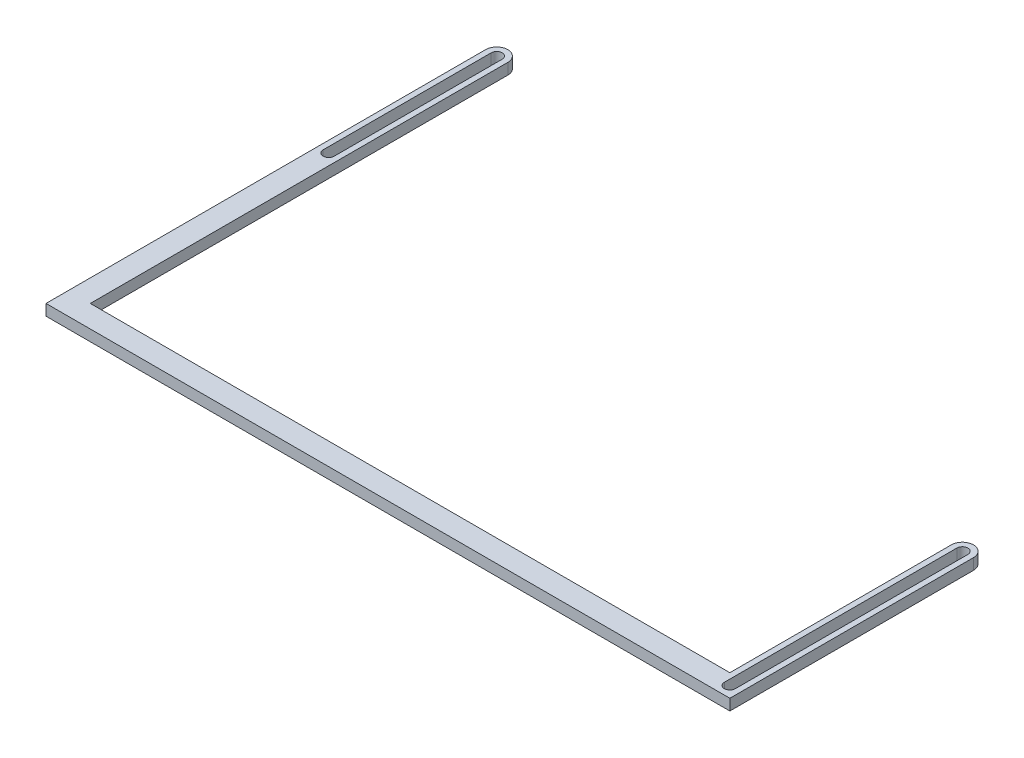
ISO-10303-21;
HEADER;
FILE_DESCRIPTION(('STEP AP214'),'2;1');
FILE_NAME('part.step','',(''),(''),'','','');
FILE_SCHEMA(('AUTOMOTIVE_DESIGN { 1 0 10303 214 1 1 1 1 }'));
ENDSEC;
DATA;
#1=APPLICATION_CONTEXT('core data for automotive mechanical design processes');
#2=APPLICATION_PROTOCOL_DEFINITION('international standard','automotive_design',2000,#1);
#3=PRODUCT_CONTEXT('',#1,'mechanical');
#4=PRODUCT('Part','Part','',(#3));
#5=PRODUCT_RELATED_PRODUCT_CATEGORY('part','',(#4));
#6=PRODUCT_DEFINITION_FORMATION('','',#4);
#7=PRODUCT_DEFINITION_CONTEXT('part definition',#1,'design');
#8=PRODUCT_DEFINITION('design','',#6,#7);
#9=PRODUCT_DEFINITION_SHAPE('','',#8);
#10=(LENGTH_UNIT() NAMED_UNIT(*) SI_UNIT(.MILLI.,.METRE.));
#11=(NAMED_UNIT(*) PLANE_ANGLE_UNIT() SI_UNIT($,.RADIAN.));
#12=(NAMED_UNIT(*) SI_UNIT($,.STERADIAN.) SOLID_ANGLE_UNIT());
#13=UNCERTAINTY_MEASURE_WITH_UNIT(LENGTH_MEASURE(1.E-05),#10,'distance_accuracy_value','');
#14=(GEOMETRIC_REPRESENTATION_CONTEXT(3) GLOBAL_UNCERTAINTY_ASSIGNED_CONTEXT((#13)) GLOBAL_UNIT_ASSIGNED_CONTEXT((#10,
#11,#12)) REPRESENTATION_CONTEXT('',''));
#15=CARTESIAN_POINT('',(0.,0.,0.));
#16=DIRECTION('',(0.,0.,1.));
#17=DIRECTION('',(1.,0.,0.));
#18=AXIS2_PLACEMENT_3D('',#15,#16,#17);
#19=CARTESIAN_POINT('',(68.1169302318838,-8.,-77.9999999999999));
#20=DIRECTION('',(0.,1.,0.));
#21=DIRECTION('',(0.,0.,1.));
#22=AXIS2_PLACEMENT_3D('',#19,#20,#21);
#23=PLANE('',#22);
#24=CARTESIAN_POINT('',(-170.948017198614,-8.,-148.837066578513));
#25=DIRECTION('',(0.,-1.,0.));
#26=DIRECTION('',(0.,0.,1.));
#27=AXIS2_PLACEMENT_3D('',#24,#25,#26);
#28=CIRCLE('',#27,2.);
#29=CARTESIAN_POINT('',(-172.948017198614,-8.,-148.837066578513));
#30=VERTEX_POINT('',#29);
#31=CARTESIAN_POINT('',(-168.948017198614,-8.,-148.837066578513));
#32=VERTEX_POINT('',#31);
#33=EDGE_CURVE('E184',#30,#32,#28,.T.);
#34=ORIENTED_EDGE('',*,*,#33,.F.);
#35=DIRECTION('',(0.,0.,-1.));
#36=VECTOR('',#35,1.);
#37=CARTESIAN_POINT('',(-172.948017198614,-8.,-148.837066578513));
#38=LINE('',#37,#36);
#39=CARTESIAN_POINT('',(-172.948017198614,-8.,-88.1363519774298));
#40=VERTEX_POINT('',#39);
#41=EDGE_CURVE('E192',#40,#30,#38,.T.);
#42=ORIENTED_EDGE('',*,*,#41,.F.);
#43=CARTESIAN_POINT('',(-170.948017198614,-8.,-88.1363519774298));
#44=DIRECTION('',(0.,-1.,0.));
#45=DIRECTION('',(0.,0.,-1.));
#46=AXIS2_PLACEMENT_3D('',#43,#44,#45);
#47=CIRCLE('',#46,2.);
#48=CARTESIAN_POINT('',(-168.948017198614,-8.,-88.1363519774298));
#49=VERTEX_POINT('',#48);
#50=EDGE_CURVE('E189',#49,#40,#47,.T.);
#51=ORIENTED_EDGE('',*,*,#50,.F.);
#52=DIRECTION('',(0.,0.,1.));
#53=VECTOR('',#52,1.);
#54=CARTESIAN_POINT('',(-168.948017198614,-8.,-148.837066578513));
#55=LINE('',#54,#53);
#56=EDGE_CURVE('E186',#32,#49,#55,.T.);
#57=ORIENTED_EDGE('',*,*,#56,.F.);
#58=EDGE_LOOP('',(#34,#42,#51,#57));
#59=FACE_BOUND('',#58,.T.);
#60=CARTESIAN_POINT('',(68.1169302318838,-8.,-77.9999999999999));
#61=DIRECTION('',(0.,-1.,0.));
#62=DIRECTION('',(0.,0.,1.));
#63=AXIS2_PLACEMENT_3D('',#60,#61,#62);
#64=CIRCLE('',#63,4.);
#65=CARTESIAN_POINT('',(64.1169302318838,-8.,-77.9999999999999));
#66=VERTEX_POINT('',#65);
#67=CARTESIAN_POINT('',(72.1169302318838,-8.,-77.9999999999999));
#68=VERTEX_POINT('',#67);
#69=EDGE_CURVE('E215',#66,#68,#64,.T.);
#70=ORIENTED_EDGE('',*,*,#69,.T.);
#71=DIRECTION('',(0.,0.,1.));
#72=VECTOR('',#71,1.);
#73=CARTESIAN_POINT('',(72.1169302318838,-8.,-77.9999999999999));
#74=LINE('',#73,#72);
#75=CARTESIAN_POINT('',(72.1169302318838,-8.,10.));
#76=VERTEX_POINT('',#75);
#77=EDGE_CURVE('E218',#68,#76,#74,.T.);
#78=ORIENTED_EDGE('',*,*,#77,.T.);
#79=DIRECTION('',(-1.,0.,0.));
#80=VECTOR('',#79,1.);
#81=CARTESIAN_POINT('',(72.1169302318838,-8.,10.));
#82=LINE('',#81,#80);
#83=CARTESIAN_POINT('',(-174.948017198614,-8.,9.99999999999997));
#84=VERTEX_POINT('',#83);
#85=EDGE_CURVE('E221',#76,#84,#82,.T.);
#86=ORIENTED_EDGE('',*,*,#85,.T.);
#87=DIRECTION('',(0.,0.,-1.));
#88=VECTOR('',#87,1.);
#89=CARTESIAN_POINT('',(-174.948017198614,-8.,9.99999999999997));
#90=LINE('',#89,#88);
#91=CARTESIAN_POINT('',(-174.948017198614,-8.,-148.837066578513));
#92=VERTEX_POINT('',#91);
#93=EDGE_CURVE('E223',#84,#92,#90,.T.);
#94=ORIENTED_EDGE('',*,*,#93,.T.);
#95=CARTESIAN_POINT('',(-170.948017198614,-8.,-148.837066578513));
#96=DIRECTION('',(0.,-1.,0.));
#97=DIRECTION('',(0.,0.,-1.));
#98=AXIS2_PLACEMENT_3D('',#95,#96,#97);
#99=CIRCLE('',#98,4.);
#100=CARTESIAN_POINT('',(-166.948017198614,-8.,-148.837066578513));
#101=VERTEX_POINT('',#100);
#102=EDGE_CURVE('E225',#92,#101,#99,.T.);
#103=ORIENTED_EDGE('',*,*,#102,.T.);
#104=DIRECTION('',(0.,0.,1.));
#105=VECTOR('',#104,1.);
#106=CARTESIAN_POINT('',(-166.948017198614,-8.,-148.837066578513));
#107=LINE('',#106,#105);
#108=CARTESIAN_POINT('',(-166.948017198614,-8.,1.99999999999997));
#109=VERTEX_POINT('',#108);
#110=EDGE_CURVE('E227',#101,#109,#107,.T.);
#111=ORIENTED_EDGE('',*,*,#110,.T.);
#112=DIRECTION('',(1.,0.,0.));
#113=VECTOR('',#112,1.);
#114=CARTESIAN_POINT('',(-9.06494743049759,-8.,1.99999999999999));
#115=LINE('',#114,#113);
#116=CARTESIAN_POINT('',(64.1169302318838,-8.,2.));
#117=VERTEX_POINT('',#116);
#118=EDGE_CURVE('E229',#109,#117,#115,.T.);
#119=ORIENTED_EDGE('',*,*,#118,.T.);
#120=DIRECTION('',(0.,0.,-1.));
#121=VECTOR('',#120,1.);
#122=CARTESIAN_POINT('',(64.1169302318838,-8.,-77.9999999999999));
#123=LINE('',#122,#121);
#124=EDGE_CURVE('E231',#117,#66,#123,.T.);
#125=ORIENTED_EDGE('',*,*,#124,.T.);
#126=EDGE_LOOP('',(#70,#78,#86,#94,#103,#111,#119,#125));
#127=FACE_BOUND('',#126,.T.);
#128=CARTESIAN_POINT('',(68.1169302318838,-8.,-77.9999999999999));
#129=DIRECTION('',(0.,-1.,0.));
#130=DIRECTION('',(0.,0.,1.));
#131=AXIS2_PLACEMENT_3D('',#128,#129,#130);
#132=CIRCLE('',#131,2.);
#133=CARTESIAN_POINT('',(66.1169302318838,-8.,-77.9999999999999));
#134=VERTEX_POINT('',#133);
#135=CARTESIAN_POINT('',(70.1169302318838,-8.,-77.9999999999999));
#136=VERTEX_POINT('',#135);
#137=EDGE_CURVE('E148',#134,#136,#132,.T.);
#138=ORIENTED_EDGE('',*,*,#137,.F.);
#139=DIRECTION('',(0.,0.,-1.));
#140=VECTOR('',#139,1.);
#141=CARTESIAN_POINT('',(66.1169302318838,-8.,-77.9999999999999));
#142=LINE('',#141,#140);
#143=CARTESIAN_POINT('',(66.1169302318838,-8.,5.99999999999998));
#144=VERTEX_POINT('',#143);
#145=EDGE_CURVE('E170',#144,#134,#142,.T.);
#146=ORIENTED_EDGE('',*,*,#145,.F.);
#147=CARTESIAN_POINT('',(68.1169302318838,-8.,5.99999999999998));
#148=DIRECTION('',(0.,-1.,0.));
#149=DIRECTION('',(0.,0.,-1.));
#150=AXIS2_PLACEMENT_3D('',#147,#148,#149);
#151=CIRCLE('',#150,2.);
#152=CARTESIAN_POINT('',(70.1169302318838,-8.,5.99999999999998));
#153=VERTEX_POINT('',#152);
#154=EDGE_CURVE('E168',#153,#144,#151,.T.);
#155=ORIENTED_EDGE('',*,*,#154,.F.);
#156=DIRECTION('',(0.,0.,1.));
#157=VECTOR('',#156,1.);
#158=CARTESIAN_POINT('',(70.1169302318838,-8.,-77.9999999999999));
#159=LINE('',#158,#157);
#160=EDGE_CURVE('E156',#136,#153,#159,.T.);
#161=ORIENTED_EDGE('',*,*,#160,.F.);
#162=EDGE_LOOP('',(#138,#146,#155,#161));
#163=FACE_BOUND('',#162,.T.);
#164=ADVANCED_FACE('F35',(#59,#127,#163),#23,.F.);
#165=CARTESIAN_POINT('',(68.1169302318838,-4.,-77.9999999999999));
#166=DIRECTION('',(0.,1.,0.));
#167=DIRECTION('',(0.,0.,1.));
#168=AXIS2_PLACEMENT_3D('',#165,#166,#167);
#169=PLANE('',#168);
#170=CARTESIAN_POINT('',(68.1169302318838,-4.,-77.9999999999999));
#171=DIRECTION('',(0.,-1.,0.));
#172=DIRECTION('',(0.,0.,1.));
#173=AXIS2_PLACEMENT_3D('',#170,#171,#172);
#174=CIRCLE('',#173,4.);
#175=CARTESIAN_POINT('',(64.1169302318838,-4.,-77.9999999999999));
#176=VERTEX_POINT('',#175);
#177=CARTESIAN_POINT('',(72.1169302318838,-4.,-77.9999999999999));
#178=VERTEX_POINT('',#177);
#179=EDGE_CURVE('E214',#176,#178,#174,.T.);
#180=ORIENTED_EDGE('',*,*,#179,.F.);
#181=DIRECTION('',(0.,0.,-1.));
#182=VECTOR('',#181,1.);
#183=CARTESIAN_POINT('',(64.1169302318838,-4.,-77.9999999999999));
#184=LINE('',#183,#182);
#185=CARTESIAN_POINT('',(64.1169302318838,-4.,2.));
#186=VERTEX_POINT('',#185);
#187=EDGE_CURVE('E219',#186,#176,#184,.T.);
#188=ORIENTED_EDGE('',*,*,#187,.F.);
#189=DIRECTION('',(1.,0.,0.));
#190=VECTOR('',#189,1.);
#191=CARTESIAN_POINT('',(64.1169302318838,-4.,2.));
#192=LINE('',#191,#190);
#193=CARTESIAN_POINT('',(-166.948017198614,-4.,1.99999999999997));
#194=VERTEX_POINT('',#193);
#195=EDGE_CURVE('E250',#194,#186,#192,.T.);
#196=ORIENTED_EDGE('',*,*,#195,.F.);
#197=DIRECTION('',(0.,0.,1.));
#198=VECTOR('',#197,1.);
#199=CARTESIAN_POINT('',(-166.948017198614,-4.,1.99999999999997));
#200=LINE('',#199,#198);
#201=CARTESIAN_POINT('',(-166.948017198614,-4.,-148.837066578513));
#202=VERTEX_POINT('',#201);
#203=EDGE_CURVE('E247',#202,#194,#200,.T.);
#204=ORIENTED_EDGE('',*,*,#203,.F.);
#205=CARTESIAN_POINT('',(-170.948017198614,-4.,-148.837066578513));
#206=DIRECTION('',(0.,-1.,0.));
#207=DIRECTION('',(0.,0.,-1.));
#208=AXIS2_PLACEMENT_3D('',#205,#206,#207);
#209=CIRCLE('',#208,4.);
#210=CARTESIAN_POINT('',(-174.948017198614,-4.,-148.837066578513));
#211=VERTEX_POINT('',#210);
#212=EDGE_CURVE('E244',#211,#202,#209,.T.);
#213=ORIENTED_EDGE('',*,*,#212,.F.);
#214=DIRECTION('',(0.,0.,-1.));
#215=VECTOR('',#214,1.);
#216=CARTESIAN_POINT('',(-174.948017198614,-4.,-148.837066578513));
#217=LINE('',#216,#215);
#218=CARTESIAN_POINT('',(-174.948017198614,-4.,9.99999999999997));
#219=VERTEX_POINT('',#218);
#220=EDGE_CURVE('E242',#219,#211,#217,.T.);
#221=ORIENTED_EDGE('',*,*,#220,.F.);
#222=DIRECTION('',(-1.,0.,0.));
#223=VECTOR('',#222,1.);
#224=CARTESIAN_POINT('',(-9.06494743049759,-4.,9.99999999999999));
#225=LINE('',#224,#223);
#226=CARTESIAN_POINT('',(72.1169302318838,-4.,10.));
#227=VERTEX_POINT('',#226);
#228=EDGE_CURVE('E239',#227,#219,#225,.T.);
#229=ORIENTED_EDGE('',*,*,#228,.F.);
#230=DIRECTION('',(0.,0.,1.));
#231=VECTOR('',#230,1.);
#232=CARTESIAN_POINT('',(72.1169302318838,-4.,-77.9999999999999));
#233=LINE('',#232,#231);
#234=EDGE_CURVE('E236',#178,#227,#233,.T.);
#235=ORIENTED_EDGE('',*,*,#234,.F.);
#236=EDGE_LOOP('',(#180,#188,#196,#204,#213,#221,#229,#235));
#237=FACE_BOUND('',#236,.T.);
#238=DIRECTION('',(0.,0.,-1.));
#239=VECTOR('',#238,1.);
#240=CARTESIAN_POINT('',(-172.948017198614,-4.,-148.837066578513));
#241=LINE('',#240,#239);
#242=CARTESIAN_POINT('',(-172.948017198614,-4.,-88.1363519774298));
#243=VERTEX_POINT('',#242);
#244=CARTESIAN_POINT('',(-172.948017198614,-4.,-148.837066578513));
#245=VERTEX_POINT('',#244);
#246=EDGE_CURVE('E187',#243,#245,#241,.T.);
#247=ORIENTED_EDGE('',*,*,#246,.T.);
#248=CARTESIAN_POINT('',(-170.948017198614,-4.,-148.837066578513));
#249=DIRECTION('',(0.,-1.,0.));
#250=DIRECTION('',(0.,0.,1.));
#251=AXIS2_PLACEMENT_3D('',#248,#249,#250);
#252=CIRCLE('',#251,2.);
#253=CARTESIAN_POINT('',(-168.948017198614,-4.,-148.837066578513));
#254=VERTEX_POINT('',#253);
#255=EDGE_CURVE('E164',#245,#254,#252,.T.);
#256=ORIENTED_EDGE('',*,*,#255,.T.);
#257=DIRECTION('',(0.,0.,1.));
#258=VECTOR('',#257,1.);
#259=CARTESIAN_POINT('',(-168.948017198614,-4.,-148.837066578513));
#260=LINE('',#259,#258);
#261=CARTESIAN_POINT('',(-168.948017198614,-4.,-88.1363519774298));
#262=VERTEX_POINT('',#261);
#263=EDGE_CURVE('E197',#254,#262,#260,.T.);
#264=ORIENTED_EDGE('',*,*,#263,.T.);
#265=CARTESIAN_POINT('',(-170.948017198614,-4.,-88.1363519774298));
#266=DIRECTION('',(0.,-1.,0.));
#267=DIRECTION('',(0.,0.,-1.));
#268=AXIS2_PLACEMENT_3D('',#265,#266,#267);
#269=CIRCLE('',#268,2.);
#270=EDGE_CURVE('E200',#262,#243,#269,.T.);
#271=ORIENTED_EDGE('',*,*,#270,.T.);
#272=EDGE_LOOP('',(#247,#256,#264,#271));
#273=FACE_BOUND('',#272,.T.);
#274=DIRECTION('',(0.,0.,-1.));
#275=VECTOR('',#274,1.);
#276=CARTESIAN_POINT('',(66.1169302318838,-4.,-77.9999999999999));
#277=LINE('',#276,#275);
#278=CARTESIAN_POINT('',(66.1169302318838,-4.,5.99999999999998));
#279=VERTEX_POINT('',#278);
#280=CARTESIAN_POINT('',(66.1169302318838,-4.,-77.9999999999999));
#281=VERTEX_POINT('',#280);
#282=EDGE_CURVE('E157',#279,#281,#277,.T.);
#283=ORIENTED_EDGE('',*,*,#282,.T.);
#284=CARTESIAN_POINT('',(68.1169302318838,-4.,-77.9999999999999));
#285=DIRECTION('',(0.,-1.,0.));
#286=DIRECTION('',(0.,0.,1.));
#287=AXIS2_PLACEMENT_3D('',#284,#285,#286);
#288=CIRCLE('',#287,2.);
#289=CARTESIAN_POINT('',(70.1169302318838,-4.,-77.9999999999999));
#290=VERTEX_POINT('',#289);
#291=EDGE_CURVE('E58',#281,#290,#288,.T.);
#292=ORIENTED_EDGE('',*,*,#291,.T.);
#293=DIRECTION('',(0.,0.,1.));
#294=VECTOR('',#293,1.);
#295=CARTESIAN_POINT('',(70.1169302318838,-4.,-77.9999999999999));
#296=LINE('',#295,#294);
#297=CARTESIAN_POINT('',(70.1169302318838,-4.,5.99999999999998));
#298=VERTEX_POINT('',#297);
#299=EDGE_CURVE('E163',#290,#298,#296,.T.);
#300=ORIENTED_EDGE('',*,*,#299,.T.);
#301=CARTESIAN_POINT('',(68.1169302318838,-4.,5.99999999999998));
#302=DIRECTION('',(0.,-1.,0.));
#303=DIRECTION('',(0.,0.,-1.));
#304=AXIS2_PLACEMENT_3D('',#301,#302,#303);
#305=CIRCLE('',#304,2.);
#306=EDGE_CURVE('E176',#298,#279,#305,.T.);
#307=ORIENTED_EDGE('',*,*,#306,.T.);
#308=EDGE_LOOP('',(#283,#292,#300,#307));
#309=FACE_BOUND('',#308,.T.);
#310=ADVANCED_FACE('F280',(#237,#273,#309),#169,.T.);
#311=CARTESIAN_POINT('',(68.1169302318838,-8.,-77.9999999999999));
#312=DIRECTION('',(0.,1.,0.));
#313=DIRECTION('',(0.,0.,1.));
#314=AXIS2_PLACEMENT_3D('',#311,#312,#313);
#315=CYLINDRICAL_SURFACE('',#314,4.);
#316=ORIENTED_EDGE('',*,*,#179,.T.);
#317=DIRECTION('',(0.,1.,0.));
#318=VECTOR('',#317,1.);
#319=CARTESIAN_POINT('',(72.1169302318838,-8.,-77.9999999999999));
#320=LINE('',#319,#318);
#321=EDGE_CURVE('E11',#68,#178,#320,.T.);
#322=ORIENTED_EDGE('',*,*,#321,.F.);
#323=ORIENTED_EDGE('',*,*,#69,.F.);
#324=DIRECTION('',(0.,1.,0.));
#325=VECTOR('',#324,1.);
#326=CARTESIAN_POINT('',(64.1169302318838,-8.,-77.9999999999999));
#327=LINE('',#326,#325);
#328=EDGE_CURVE('E233',#66,#176,#327,.T.);
#329=ORIENTED_EDGE('',*,*,#328,.T.);
#330=EDGE_LOOP('',(#316,#322,#323,#329));
#331=FACE_BOUND('',#330,.T.);
#332=ADVANCED_FACE('F37',(#331),#315,.T.);
#333=CARTESIAN_POINT('',(72.1169302318838,-8.,-77.9999999999999));
#334=DIRECTION('',(-1.,0.,0.));
#335=DIRECTION('',(0.,0.,1.));
#336=AXIS2_PLACEMENT_3D('',#333,#334,#335);
#337=PLANE('',#336);
#338=ORIENTED_EDGE('',*,*,#234,.T.);
#339=DIRECTION('',(0.,1.,0.));
#340=VECTOR('',#339,1.);
#341=CARTESIAN_POINT('',(72.1169302318838,-8.,10.));
#342=LINE('',#341,#340);
#343=EDGE_CURVE('E43',#76,#227,#342,.T.);
#344=ORIENTED_EDGE('',*,*,#343,.F.);
#345=ORIENTED_EDGE('',*,*,#77,.F.);
#346=ORIENTED_EDGE('',*,*,#321,.T.);
#347=EDGE_LOOP('',(#338,#344,#345,#346));
#348=FACE_BOUND('',#347,.T.);
#349=ADVANCED_FACE('F276',(#348),#337,.F.);
#350=CARTESIAN_POINT('',(-9.06494743049759,-8.,9.99999999999999));
#351=DIRECTION('',(0.,0.,-1.));
#352=DIRECTION('',(-1.,0.,0.));
#353=AXIS2_PLACEMENT_3D('',#350,#351,#352);
#354=PLANE('',#353);
#355=ORIENTED_EDGE('',*,*,#228,.T.);
#356=DIRECTION('',(0.,1.,0.));
#357=VECTOR('',#356,1.);
#358=CARTESIAN_POINT('',(-174.948017198614,-8.,9.99999999999997));
#359=LINE('',#358,#357);
#360=EDGE_CURVE('E267',#84,#219,#359,.T.);
#361=ORIENTED_EDGE('',*,*,#360,.F.);
#362=ORIENTED_EDGE('',*,*,#85,.F.);
#363=ORIENTED_EDGE('',*,*,#343,.T.);
#364=EDGE_LOOP('',(#355,#361,#362,#363));
#365=FACE_BOUND('',#364,.T.);
#366=ADVANCED_FACE('F273',(#365),#354,.F.);
#367=CARTESIAN_POINT('',(-174.948017198614,-8.,-148.837066578513));
#368=DIRECTION('',(1.,0.,0.));
#369=DIRECTION('',(0.,0.,-1.));
#370=AXIS2_PLACEMENT_3D('',#367,#368,#369);
#371=PLANE('',#370);
#372=ORIENTED_EDGE('',*,*,#220,.T.);
#373=DIRECTION('',(0.,1.,0.));
#374=VECTOR('',#373,1.);
#375=CARTESIAN_POINT('',(-174.948017198614,-8.,-148.837066578513));
#376=LINE('',#375,#374);
#377=EDGE_CURVE('E264',#92,#211,#376,.T.);
#378=ORIENTED_EDGE('',*,*,#377,.F.);
#379=ORIENTED_EDGE('',*,*,#93,.F.);
#380=ORIENTED_EDGE('',*,*,#360,.T.);
#381=EDGE_LOOP('',(#372,#378,#379,#380));
#382=FACE_BOUND('',#381,.T.);
#383=ADVANCED_FACE('F286',(#382),#371,.F.);
#384=CARTESIAN_POINT('',(-170.948017198614,-8.,-148.837066578513));
#385=DIRECTION('',(0.,1.,0.));
#386=DIRECTION('',(0.,0.,1.));
#387=AXIS2_PLACEMENT_3D('',#384,#385,#386);
#388=CYLINDRICAL_SURFACE('',#387,4.);
#389=ORIENTED_EDGE('',*,*,#212,.T.);
#390=DIRECTION('',(0.,1.,0.));
#391=VECTOR('',#390,1.);
#392=CARTESIAN_POINT('',(-166.948017198614,-8.,-148.837066578513));
#393=LINE('',#392,#391);
#394=EDGE_CURVE('E261',#101,#202,#393,.T.);
#395=ORIENTED_EDGE('',*,*,#394,.F.);
#396=ORIENTED_EDGE('',*,*,#102,.F.);
#397=ORIENTED_EDGE('',*,*,#377,.T.);
#398=EDGE_LOOP('',(#389,#395,#396,#397));
#399=FACE_BOUND('',#398,.T.);
#400=ADVANCED_FACE('F290',(#399),#388,.T.);
#401=CARTESIAN_POINT('',(-166.948017198614,-8.,1.99999999999997));
#402=DIRECTION('',(-1.,0.,0.));
#403=DIRECTION('',(0.,0.,1.));
#404=AXIS2_PLACEMENT_3D('',#401,#402,#403);
#405=PLANE('',#404);
#406=ORIENTED_EDGE('',*,*,#203,.T.);
#407=DIRECTION('',(0.,1.,0.));
#408=VECTOR('',#407,1.);
#409=CARTESIAN_POINT('',(-166.948017198614,-8.,1.99999999999997));
#410=LINE('',#409,#408);
#411=EDGE_CURVE('E258',#109,#194,#410,.T.);
#412=ORIENTED_EDGE('',*,*,#411,.F.);
#413=ORIENTED_EDGE('',*,*,#110,.F.);
#414=ORIENTED_EDGE('',*,*,#394,.T.);
#415=EDGE_LOOP('',(#406,#412,#413,#414));
#416=FACE_BOUND('',#415,.T.);
#417=ADVANCED_FACE('F304',(#416),#405,.F.);
#418=CARTESIAN_POINT('',(64.1169302318838,-8.,2.));
#419=DIRECTION('',(0.,0.,1.));
#420=DIRECTION('',(1.,0.,0.));
#421=AXIS2_PLACEMENT_3D('',#418,#419,#420);
#422=PLANE('',#421);
#423=ORIENTED_EDGE('',*,*,#195,.T.);
#424=DIRECTION('',(0.,1.,0.));
#425=VECTOR('',#424,1.);
#426=CARTESIAN_POINT('',(64.1169302318838,-8.,2.));
#427=LINE('',#426,#425);
#428=EDGE_CURVE('E255',#117,#186,#427,.T.);
#429=ORIENTED_EDGE('',*,*,#428,.F.);
#430=ORIENTED_EDGE('',*,*,#118,.F.);
#431=ORIENTED_EDGE('',*,*,#411,.T.);
#432=EDGE_LOOP('',(#423,#429,#430,#431));
#433=FACE_BOUND('',#432,.T.);
#434=ADVANCED_FACE('F306',(#433),#422,.F.);
#435=CARTESIAN_POINT('',(64.1169302318838,-8.,-77.9999999999999));
#436=DIRECTION('',(1.,0.,0.));
#437=DIRECTION('',(0.,0.,-1.));
#438=AXIS2_PLACEMENT_3D('',#435,#436,#437);
#439=PLANE('',#438);
#440=ORIENTED_EDGE('',*,*,#187,.T.);
#441=ORIENTED_EDGE('',*,*,#328,.F.);
#442=ORIENTED_EDGE('',*,*,#124,.F.);
#443=ORIENTED_EDGE('',*,*,#428,.T.);
#444=EDGE_LOOP('',(#440,#441,#442,#443));
#445=FACE_BOUND('',#444,.T.);
#446=ADVANCED_FACE('F300',(#445),#439,.F.);
#447=CARTESIAN_POINT('',(-170.948017198614,-8.,-148.837066578513));
#448=DIRECTION('',(0.,1.,0.));
#449=DIRECTION('',(0.,0.,1.));
#450=AXIS2_PLACEMENT_3D('',#447,#448,#449);
#451=CYLINDRICAL_SURFACE('',#450,2.);
#452=ORIENTED_EDGE('',*,*,#255,.F.);
#453=DIRECTION('',(0.,1.,0.));
#454=VECTOR('',#453,1.);
#455=CARTESIAN_POINT('',(-172.948017198614,-8.,-148.837066578513));
#456=LINE('',#455,#454);
#457=EDGE_CURVE('E194',#30,#245,#456,.T.);
#458=ORIENTED_EDGE('',*,*,#457,.F.);
#459=ORIENTED_EDGE('',*,*,#33,.T.);
#460=DIRECTION('',(0.,1.,0.));
#461=VECTOR('',#460,1.);
#462=CARTESIAN_POINT('',(-168.948017198614,-8.,-148.837066578513));
#463=LINE('',#462,#461);
#464=EDGE_CURVE('E211',#32,#254,#463,.T.);
#465=ORIENTED_EDGE('',*,*,#464,.T.);
#466=EDGE_LOOP('',(#452,#458,#459,#465));
#467=FACE_BOUND('',#466,.T.);
#468=ADVANCED_FACE('F313',(#467),#451,.F.);
#469=CARTESIAN_POINT('',(-168.948017198614,-8.,-148.837066578513));
#470=DIRECTION('',(-1.,0.,0.));
#471=DIRECTION('',(0.,0.,1.));
#472=AXIS2_PLACEMENT_3D('',#469,#470,#471);
#473=PLANE('',#472);
#474=ORIENTED_EDGE('',*,*,#263,.F.);
#475=ORIENTED_EDGE('',*,*,#464,.F.);
#476=ORIENTED_EDGE('',*,*,#56,.T.);
#477=DIRECTION('',(0.,1.,0.));
#478=VECTOR('',#477,1.);
#479=CARTESIAN_POINT('',(-168.948017198614,-8.,-88.1363519774298));
#480=LINE('',#479,#478);
#481=EDGE_CURVE('E209',#49,#262,#480,.T.);
#482=ORIENTED_EDGE('',*,*,#481,.T.);
#483=EDGE_LOOP('',(#474,#475,#476,#482));
#484=FACE_BOUND('',#483,.T.);
#485=ADVANCED_FACE('F327',(#484),#473,.T.);
#486=CARTESIAN_POINT('',(-170.948017198614,-8.,-88.1363519774298));
#487=DIRECTION('',(0.,1.,0.));
#488=DIRECTION('',(0.,0.,1.));
#489=AXIS2_PLACEMENT_3D('',#486,#487,#488);
#490=CYLINDRICAL_SURFACE('',#489,2.);
#491=ORIENTED_EDGE('',*,*,#270,.F.);
#492=ORIENTED_EDGE('',*,*,#481,.F.);
#493=ORIENTED_EDGE('',*,*,#50,.T.);
#494=DIRECTION('',(0.,1.,0.));
#495=VECTOR('',#494,1.);
#496=CARTESIAN_POINT('',(-172.948017198614,-8.,-88.1363519774298));
#497=LINE('',#496,#495);
#498=EDGE_CURVE('E207',#40,#243,#497,.T.);
#499=ORIENTED_EDGE('',*,*,#498,.T.);
#500=EDGE_LOOP('',(#491,#492,#493,#499));
#501=FACE_BOUND('',#500,.T.);
#502=ADVANCED_FACE('F331',(#501),#490,.F.);
#503=CARTESIAN_POINT('',(-172.948017198614,-8.,-148.837066578513));
#504=DIRECTION('',(1.,0.,0.));
#505=DIRECTION('',(0.,0.,-1.));
#506=AXIS2_PLACEMENT_3D('',#503,#504,#505);
#507=PLANE('',#506);
#508=ORIENTED_EDGE('',*,*,#246,.F.);
#509=ORIENTED_EDGE('',*,*,#498,.F.);
#510=ORIENTED_EDGE('',*,*,#41,.T.);
#511=ORIENTED_EDGE('',*,*,#457,.T.);
#512=EDGE_LOOP('',(#508,#509,#510,#511));
#513=FACE_BOUND('',#512,.T.);
#514=ADVANCED_FACE('F335',(#513),#507,.T.);
#515=CARTESIAN_POINT('',(68.1169302318838,-8.,-77.9999999999999));
#516=DIRECTION('',(0.,1.,0.));
#517=DIRECTION('',(0.,0.,1.));
#518=AXIS2_PLACEMENT_3D('',#515,#516,#517);
#519=CYLINDRICAL_SURFACE('',#518,2.);
#520=ORIENTED_EDGE('',*,*,#291,.F.);
#521=DIRECTION('',(0.,1.,0.));
#522=VECTOR('',#521,1.);
#523=CARTESIAN_POINT('',(66.1169302318838,-8.,-77.9999999999999));
#524=LINE('',#523,#522);
#525=EDGE_CURVE('E152',#134,#281,#524,.T.);
#526=ORIENTED_EDGE('',*,*,#525,.F.);
#527=ORIENTED_EDGE('',*,*,#137,.T.);
#528=DIRECTION('',(0.,1.,0.));
#529=VECTOR('',#528,1.);
#530=CARTESIAN_POINT('',(70.1169302318838,-8.,-77.9999999999999));
#531=LINE('',#530,#529);
#532=EDGE_CURVE('E151',#136,#290,#531,.T.);
#533=ORIENTED_EDGE('',*,*,#532,.T.);
#534=EDGE_LOOP('',(#520,#526,#527,#533));
#535=FACE_BOUND('',#534,.T.);
#536=ADVANCED_FACE('F150',(#535),#519,.F.);
#537=CARTESIAN_POINT('',(70.1169302318838,-8.,-77.9999999999999));
#538=DIRECTION('',(-1.,0.,0.));
#539=DIRECTION('',(0.,0.,1.));
#540=AXIS2_PLACEMENT_3D('',#537,#538,#539);
#541=PLANE('',#540);
#542=ORIENTED_EDGE('',*,*,#299,.F.);
#543=ORIENTED_EDGE('',*,*,#532,.F.);
#544=ORIENTED_EDGE('',*,*,#160,.T.);
#545=DIRECTION('',(0.,1.,0.));
#546=VECTOR('',#545,1.);
#547=CARTESIAN_POINT('',(70.1169302318838,-8.,5.99999999999998));
#548=LINE('',#547,#546);
#549=EDGE_CURVE('E165',#153,#298,#548,.T.);
#550=ORIENTED_EDGE('',*,*,#549,.T.);
#551=EDGE_LOOP('',(#542,#543,#544,#550));
#552=FACE_BOUND('',#551,.T.);
#553=ADVANCED_FACE('F160',(#552),#541,.T.);
#554=CARTESIAN_POINT('',(68.1169302318838,-8.,5.99999999999998));
#555=DIRECTION('',(0.,1.,0.));
#556=DIRECTION('',(0.,0.,1.));
#557=AXIS2_PLACEMENT_3D('',#554,#555,#556);
#558=CYLINDRICAL_SURFACE('',#557,2.);
#559=ORIENTED_EDGE('',*,*,#306,.F.);
#560=ORIENTED_EDGE('',*,*,#549,.F.);
#561=ORIENTED_EDGE('',*,*,#154,.T.);
#562=DIRECTION('',(0.,1.,0.));
#563=VECTOR('',#562,1.);
#564=CARTESIAN_POINT('',(66.1169302318838,-8.,5.99999999999998));
#565=LINE('',#564,#563);
#566=EDGE_CURVE('E50',#144,#279,#565,.T.);
#567=ORIENTED_EDGE('',*,*,#566,.T.);
#568=EDGE_LOOP('',(#559,#560,#561,#567));
#569=FACE_BOUND('',#568,.T.);
#570=ADVANCED_FACE('F344',(#569),#558,.F.);
#571=CARTESIAN_POINT('',(66.1169302318838,-8.,-77.9999999999999));
#572=DIRECTION('',(1.,0.,0.));
#573=DIRECTION('',(0.,0.,-1.));
#574=AXIS2_PLACEMENT_3D('',#571,#572,#573);
#575=PLANE('',#574);
#576=ORIENTED_EDGE('',*,*,#282,.F.);
#577=ORIENTED_EDGE('',*,*,#566,.F.);
#578=ORIENTED_EDGE('',*,*,#145,.T.);
#579=ORIENTED_EDGE('',*,*,#525,.T.);
#580=EDGE_LOOP('',(#576,#577,#578,#579));
#581=FACE_BOUND('',#580,.T.);
#582=ADVANCED_FACE('F347',(#581),#575,.T.);
#583=CLOSED_SHELL('',(#164,#310,#332,#349,#366,#383,#400,#417,#434,#446,#468,#485,#502,#514,
#536,#553,#570,#582));
#584=MANIFOLD_SOLID_BREP('B2',#583);
#585=ADVANCED_BREP_SHAPE_REPRESENTATION('',(#18,#584),#14);
#586=SHAPE_DEFINITION_REPRESENTATION(#9,#585);
ENDSEC;
END-ISO-10303-21;
